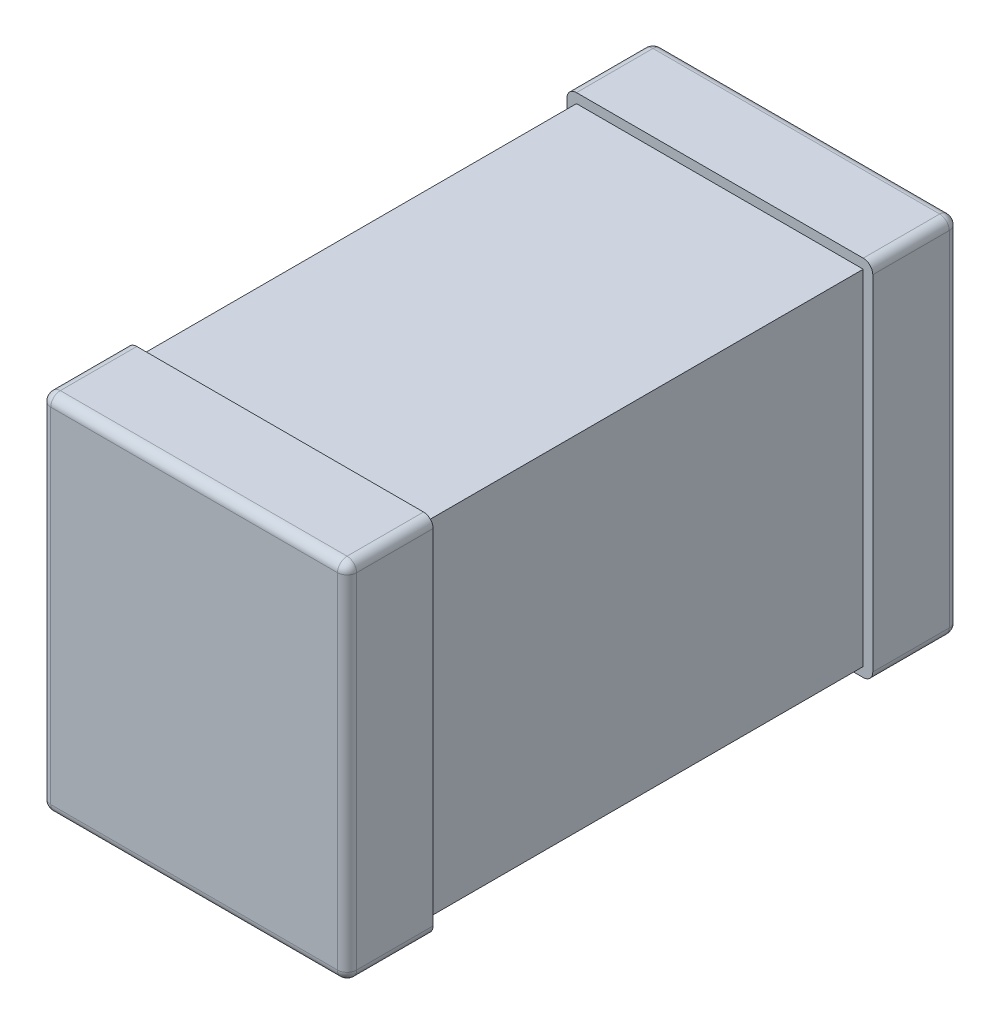
ISO-10303-21;
HEADER;
FILE_DESCRIPTION(('STEP AP214'),'2;1');
FILE_NAME('part.step','',(''),(''),'','','');
FILE_SCHEMA(('AUTOMOTIVE_DESIGN { 1 0 10303 214 1 1 1 1 }'));
ENDSEC;
DATA;
#1=APPLICATION_CONTEXT('core data for automotive mechanical design processes');
#2=APPLICATION_PROTOCOL_DEFINITION('international standard','automotive_design',2000,#1);
#3=PRODUCT_CONTEXT('',#1,'mechanical');
#4=PRODUCT('Part','Part','',(#3));
#5=PRODUCT_RELATED_PRODUCT_CATEGORY('part','',(#4));
#6=PRODUCT_DEFINITION_FORMATION('','',#4);
#7=PRODUCT_DEFINITION_CONTEXT('part definition',#1,'design');
#8=PRODUCT_DEFINITION('design','',#6,#7);
#9=PRODUCT_DEFINITION_SHAPE('','',#8);
#10=(LENGTH_UNIT() NAMED_UNIT(*) SI_UNIT(.MILLI.,.METRE.));
#11=(NAMED_UNIT(*) PLANE_ANGLE_UNIT() SI_UNIT($,.RADIAN.));
#12=(NAMED_UNIT(*) SI_UNIT($,.STERADIAN.) SOLID_ANGLE_UNIT());
#13=UNCERTAINTY_MEASURE_WITH_UNIT(LENGTH_MEASURE(1.E-05),#10,'distance_accuracy_value','');
#14=(GEOMETRIC_REPRESENTATION_CONTEXT(3) GLOBAL_UNCERTAINTY_ASSIGNED_CONTEXT((#13)) GLOBAL_UNIT_ASSIGNED_CONTEXT((#10,
#11,#12)) REPRESENTATION_CONTEXT('',''));
#15=CARTESIAN_POINT('',(0.,0.,0.));
#16=DIRECTION('',(0.,0.,1.));
#17=DIRECTION('',(1.,0.,0.));
#18=AXIS2_PLACEMENT_3D('',#15,#16,#17);
#19=CARTESIAN_POINT('',(-0.8,1.9,1.6));
#20=DIRECTION('',(0.,0.,-1.));
#21=DIRECTION('',(-1.,0.,0.));
#22=AXIS2_PLACEMENT_3D('',#19,#20,#21);
#23=PLANE('',#22);
#24=DIRECTION('',(0.,-1.,0.));
#25=VECTOR('',#24,1.);
#26=CARTESIAN_POINT('',(-0.75,1.9,1.6));
#27=LINE('',#26,#25);
#28=CARTESIAN_POINT('',(-0.75,0.0499999999999999,1.6));
#29=VERTEX_POINT('',#28);
#30=CARTESIAN_POINT('',(-0.75,1.85,1.6));
#31=VERTEX_POINT('',#30);
#32=EDGE_CURVE('E552',#29,#31,#27,.F.);
#33=ORIENTED_EDGE('',*,*,#32,.F.);
#34=DIRECTION('',(1.,0.,0.));
#35=VECTOR('',#34,1.);
#36=CARTESIAN_POINT('',(-0.8,0.0499999999999999,1.6));
#37=LINE('',#36,#35);
#38=CARTESIAN_POINT('',(0.75,0.0499999999999341,1.6));
#39=VERTEX_POINT('',#38);
#40=EDGE_CURVE('E479',#39,#29,#37,.F.);
#41=ORIENTED_EDGE('',*,*,#40,.F.);
#42=DIRECTION('',(0.,-1.,0.));
#43=VECTOR('',#42,1.);
#44=CARTESIAN_POINT('',(0.75,1.9,1.6));
#45=LINE('',#44,#43);
#46=CARTESIAN_POINT('',(0.75,1.85,1.6));
#47=VERTEX_POINT('',#46);
#48=EDGE_CURVE('E537',#47,#39,#45,.T.);
#49=ORIENTED_EDGE('',*,*,#48,.F.);
#50=DIRECTION('',(-1.,0.,0.));
#51=VECTOR('',#50,1.);
#52=CARTESIAN_POINT('',(-0.8,1.85,1.6));
#53=LINE('',#52,#51);
#54=EDGE_CURVE('E523',#31,#47,#53,.F.);
#55=ORIENTED_EDGE('',*,*,#54,.F.);
#56=EDGE_LOOP('',(#33,#41,#49,#55));
#57=FACE_BOUND('',#56,.T.);
#58=ADVANCED_FACE('F16',(#57),#23,.F.);
#59=CARTESIAN_POINT('',(-0.800000000000001,1.9,-1.6));
#60=DIRECTION('',(0.,0.,1.));
#61=DIRECTION('',(1.,0.,0.));
#62=AXIS2_PLACEMENT_3D('',#59,#60,#61);
#63=PLANE('',#62);
#64=DIRECTION('',(0.,-1.,0.));
#65=VECTOR('',#64,1.);
#66=CARTESIAN_POINT('',(0.750000000000001,1.9,-1.6));
#67=LINE('',#66,#65);
#68=CARTESIAN_POINT('',(0.750000000000001,0.0499999999999999,-1.6));
#69=VERTEX_POINT('',#68);
#70=CARTESIAN_POINT('',(0.750000000000001,1.85,-1.6));
#71=VERTEX_POINT('',#70);
#72=EDGE_CURVE('E513',#69,#71,#67,.F.);
#73=ORIENTED_EDGE('',*,*,#72,.F.);
#74=DIRECTION('',(1.,0.,0.));
#75=VECTOR('',#74,1.);
#76=CARTESIAN_POINT('',(-0.800000000000001,0.0499999999999999,-1.6));
#77=LINE('',#76,#75);
#78=CARTESIAN_POINT('',(-0.750000000000001,0.0499999999999999,-1.6));
#79=VERTEX_POINT('',#78);
#80=EDGE_CURVE('E519',#79,#69,#77,.T.);
#81=ORIENTED_EDGE('',*,*,#80,.F.);
#82=DIRECTION('',(0.,-1.,0.));
#83=VECTOR('',#82,1.);
#84=CARTESIAN_POINT('',(-0.750000000000001,1.9,-1.6));
#85=LINE('',#84,#83);
#86=CARTESIAN_POINT('',(-0.750000000000001,1.85,-1.6));
#87=VERTEX_POINT('',#86);
#88=EDGE_CURVE('E531',#87,#79,#85,.T.);
#89=ORIENTED_EDGE('',*,*,#88,.F.);
#90=DIRECTION('',(1.,0.,0.));
#91=VECTOR('',#90,1.);
#92=CARTESIAN_POINT('',(-0.8,1.85,-1.6));
#93=LINE('',#92,#91);
#94=EDGE_CURVE('E373',#71,#87,#93,.F.);
#95=ORIENTED_EDGE('',*,*,#94,.F.);
#96=EDGE_LOOP('',(#73,#81,#89,#95));
#97=FACE_BOUND('',#96,.T.);
#98=ADVANCED_FACE('F506',(#97),#63,.F.);
#99=CARTESIAN_POINT('',(-0.75,1.85,1.55));
#100=DIRECTION('',(1.,0.,0.));
#101=DIRECTION('',(0.,0.,-1.));
#102=AXIS2_PLACEMENT_3D('',#99,#100,#101);
#103=SPHERICAL_SURFACE('',#102,0.05);
#104=CARTESIAN_POINT('',(-0.75,1.85,1.55));
#105=DIRECTION('',(0.,0.,-1.));
#106=DIRECTION('',(-1.,0.,0.));
#107=AXIS2_PLACEMENT_3D('',#104,#105,#106);
#108=CIRCLE('',#107,0.05);
#109=CARTESIAN_POINT('',(-0.8,1.85,1.55));
#110=VERTEX_POINT('',#109);
#111=CARTESIAN_POINT('',(-0.75,1.9,1.55));
#112=VERTEX_POINT('',#111);
#113=EDGE_CURVE('E189',#110,#112,#108,.T.);
#114=ORIENTED_EDGE('',*,*,#113,.F.);
#115=CARTESIAN_POINT('',(-0.75,1.85,1.55));
#116=DIRECTION('',(0.,-1.,0.));
#117=DIRECTION('',(0.,0.,-1.));
#118=AXIS2_PLACEMENT_3D('',#115,#116,#117);
#119=CIRCLE('',#118,0.0499999999999999);
#120=EDGE_CURVE('E522',#31,#110,#119,.T.);
#121=ORIENTED_EDGE('',*,*,#120,.F.);
#122=CARTESIAN_POINT('',(-0.75,1.85,1.55));
#123=DIRECTION('',(-1.,0.,0.));
#124=DIRECTION('',(0.,0.,1.));
#125=AXIS2_PLACEMENT_3D('',#122,#123,#124);
#126=CIRCLE('',#125,0.0499999999999999);
#127=EDGE_CURVE('E429',#112,#31,#126,.F.);
#128=ORIENTED_EDGE('',*,*,#127,.F.);
#129=EDGE_LOOP('',(#114,#121,#128));
#130=FACE_BOUND('',#129,.T.);
#131=ADVANCED_FACE('F502',(#130),#103,.T.);
#132=CARTESIAN_POINT('',(-0.75,1.9,1.55));
#133=DIRECTION('',(0.,-1.,0.));
#134=DIRECTION('',(0.,0.,-1.));
#135=AXIS2_PLACEMENT_3D('',#132,#133,#134);
#136=CYLINDRICAL_SURFACE('',#135,0.0499999999999999);
#137=CARTESIAN_POINT('',(-0.75,0.05,1.55));
#138=DIRECTION('',(0.,-1.,0.));
#139=DIRECTION('',(1.,0.,0.));
#140=AXIS2_PLACEMENT_3D('',#137,#138,#139);
#141=CIRCLE('',#140,0.05);
#142=CARTESIAN_POINT('',(-0.8,0.0499999999999999,1.55));
#143=VERTEX_POINT('',#142);
#144=EDGE_CURVE('E493',#29,#143,#141,.T.);
#145=ORIENTED_EDGE('',*,*,#144,.F.);
#146=ORIENTED_EDGE('',*,*,#32,.T.);
#147=ORIENTED_EDGE('',*,*,#120,.T.);
#148=DIRECTION('',(0.,1.,0.));
#149=VECTOR('',#148,1.);
#150=CARTESIAN_POINT('',(-0.8,1.9,1.55));
#151=LINE('',#150,#149);
#152=EDGE_CURVE('E186',#110,#143,#151,.F.);
#153=ORIENTED_EDGE('',*,*,#152,.T.);
#154=EDGE_LOOP('',(#145,#146,#147,#153));
#155=FACE_BOUND('',#154,.T.);
#156=ADVANCED_FACE('F498',(#155),#136,.T.);
#157=CARTESIAN_POINT('',(-0.75,0.05,1.55));
#158=DIRECTION('',(1.,0.,0.));
#159=DIRECTION('',(0.,0.,-1.));
#160=AXIS2_PLACEMENT_3D('',#157,#158,#159);
#161=SPHERICAL_SURFACE('',#160,0.05);
#162=CARTESIAN_POINT('',(-0.75,0.0499999999999999,1.55));
#163=DIRECTION('',(1.,0.,0.));
#164=DIRECTION('',(0.,0.,-1.));
#165=AXIS2_PLACEMENT_3D('',#162,#163,#164);
#166=CIRCLE('',#165,0.0499999999999999);
#167=CARTESIAN_POINT('',(-0.75,0.,1.55));
#168=VERTEX_POINT('',#167);
#169=EDGE_CURVE('E474',#29,#168,#166,.T.);
#170=ORIENTED_EDGE('',*,*,#169,.F.);
#171=ORIENTED_EDGE('',*,*,#144,.T.);
#172=CARTESIAN_POINT('',(-0.75,0.0499999999999999,1.55));
#173=DIRECTION('',(0.,0.,1.));
#174=DIRECTION('',(1.,0.,0.));
#175=AXIS2_PLACEMENT_3D('',#172,#173,#174);
#176=CIRCLE('',#175,0.05);
#177=EDGE_CURVE('E309',#168,#143,#176,.F.);
#178=ORIENTED_EDGE('',*,*,#177,.F.);
#179=EDGE_LOOP('',(#170,#171,#178));
#180=FACE_BOUND('',#179,.T.);
#181=ADVANCED_FACE('F495',(#180),#161,.T.);
#182=CARTESIAN_POINT('',(-0.8,0.0499999999999999,1.55));
#183=DIRECTION('',(1.,0.,0.));
#184=DIRECTION('',(0.,0.,-1.));
#185=AXIS2_PLACEMENT_3D('',#182,#183,#184);
#186=CYLINDRICAL_SURFACE('',#185,0.0499999999999999);
#187=ORIENTED_EDGE('',*,*,#169,.T.);
#188=DIRECTION('',(1.,0.,0.));
#189=VECTOR('',#188,1.);
#190=CARTESIAN_POINT('',(-0.8,0.,1.55));
#191=LINE('',#190,#189);
#192=CARTESIAN_POINT('',(0.75,0.,1.55));
#193=VERTEX_POINT('',#192);
#194=EDGE_CURVE('E303',#168,#193,#191,.T.);
#195=ORIENTED_EDGE('',*,*,#194,.T.);
#196=CARTESIAN_POINT('',(0.75,0.05,1.55));
#197=DIRECTION('',(1.,0.,0.));
#198=DIRECTION('',(0.,0.,-1.));
#199=AXIS2_PLACEMENT_3D('',#196,#197,#198);
#200=CIRCLE('',#199,0.0499999999999999);
#201=EDGE_CURVE('E470',#39,#193,#200,.T.);
#202=ORIENTED_EDGE('',*,*,#201,.F.);
#203=ORIENTED_EDGE('',*,*,#40,.T.);
#204=EDGE_LOOP('',(#187,#195,#202,#203));
#205=FACE_BOUND('',#204,.T.);
#206=ADVANCED_FACE('F462',(#205),#186,.T.);
#207=CARTESIAN_POINT('',(0.75,0.05,1.55));
#208=DIRECTION('',(1.,0.,0.));
#209=DIRECTION('',(0.,0.,-1.));
#210=AXIS2_PLACEMENT_3D('',#207,#208,#209);
#211=SPHERICAL_SURFACE('',#210,0.05);
#212=CARTESIAN_POINT('',(0.75,0.0499999999999999,1.55));
#213=DIRECTION('',(0.,-1.,0.));
#214=DIRECTION('',(0.,0.,-1.));
#215=AXIS2_PLACEMENT_3D('',#212,#213,#214);
#216=CIRCLE('',#215,0.0499999999999999);
#217=CARTESIAN_POINT('',(0.8,0.0499999999999999,1.55));
#218=VERTEX_POINT('',#217);
#219=EDGE_CURVE('E473',#39,#218,#216,.F.);
#220=ORIENTED_EDGE('',*,*,#219,.F.);
#221=ORIENTED_EDGE('',*,*,#201,.T.);
#222=CARTESIAN_POINT('',(0.75,0.0499999999999999,1.55));
#223=DIRECTION('',(0.,0.,-1.));
#224=DIRECTION('',(-1.,0.,0.));
#225=AXIS2_PLACEMENT_3D('',#222,#223,#224);
#226=CIRCLE('',#225,0.05);
#227=EDGE_CURVE('E296',#218,#193,#226,.T.);
#228=ORIENTED_EDGE('',*,*,#227,.F.);
#229=EDGE_LOOP('',(#220,#221,#228));
#230=FACE_BOUND('',#229,.T.);
#231=ADVANCED_FACE('F457',(#230),#211,.T.);
#232=CARTESIAN_POINT('',(0.75,1.9,1.55));
#233=DIRECTION('',(0.,-1.,0.));
#234=DIRECTION('',(0.,0.,-1.));
#235=AXIS2_PLACEMENT_3D('',#232,#233,#234);
#236=CYLINDRICAL_SURFACE('',#235,0.0499999999999999);
#237=CARTESIAN_POINT('',(0.75,1.85,1.55));
#238=DIRECTION('',(0.,-1.,0.));
#239=DIRECTION('',(1.,0.,0.));
#240=AXIS2_PLACEMENT_3D('',#237,#238,#239);
#241=CIRCLE('',#240,0.05);
#242=CARTESIAN_POINT('',(0.8,1.85,1.55));
#243=VERTEX_POINT('',#242);
#244=EDGE_CURVE('E439',#47,#243,#241,.F.);
#245=ORIENTED_EDGE('',*,*,#244,.F.);
#246=ORIENTED_EDGE('',*,*,#48,.T.);
#247=ORIENTED_EDGE('',*,*,#219,.T.);
#248=DIRECTION('',(0.,1.,0.));
#249=VECTOR('',#248,1.);
#250=CARTESIAN_POINT('',(0.8,1.9,1.55));
#251=LINE('',#250,#249);
#252=EDGE_CURVE('E290',#218,#243,#251,.T.);
#253=ORIENTED_EDGE('',*,*,#252,.T.);
#254=EDGE_LOOP('',(#245,#246,#247,#253));
#255=FACE_BOUND('',#254,.T.);
#256=ADVANCED_FACE('F453',(#255),#236,.T.);
#257=CARTESIAN_POINT('',(0.75,1.85,1.55));
#258=DIRECTION('',(1.,0.,0.));
#259=DIRECTION('',(0.,0.,-1.));
#260=AXIS2_PLACEMENT_3D('',#257,#258,#259);
#261=SPHERICAL_SURFACE('',#260,0.05);
#262=CARTESIAN_POINT('',(0.75,1.85,1.55));
#263=DIRECTION('',(0.,0.,1.));
#264=DIRECTION('',(1.,0.,0.));
#265=AXIS2_PLACEMENT_3D('',#262,#263,#264);
#266=CIRCLE('',#265,0.05);
#267=CARTESIAN_POINT('',(0.75,1.9,1.55));
#268=VERTEX_POINT('',#267);
#269=EDGE_CURVE('E283',#268,#243,#266,.F.);
#270=ORIENTED_EDGE('',*,*,#269,.F.);
#271=CARTESIAN_POINT('',(0.75,1.85,1.55));
#272=DIRECTION('',(-1.,0.,0.));
#273=DIRECTION('',(0.,0.,1.));
#274=AXIS2_PLACEMENT_3D('',#271,#272,#273);
#275=CIRCLE('',#274,0.0499999999999999);
#276=EDGE_CURVE('E434',#47,#268,#275,.T.);
#277=ORIENTED_EDGE('',*,*,#276,.F.);
#278=ORIENTED_EDGE('',*,*,#244,.T.);
#279=EDGE_LOOP('',(#270,#277,#278));
#280=FACE_BOUND('',#279,.T.);
#281=ADVANCED_FACE('F450',(#280),#261,.T.);
#282=CARTESIAN_POINT('',(-0.8,1.85,1.55));
#283=DIRECTION('',(-1.,0.,0.));
#284=DIRECTION('',(0.,0.,1.));
#285=AXIS2_PLACEMENT_3D('',#282,#283,#284);
#286=CYLINDRICAL_SURFACE('',#285,0.0499999999999999);
#287=ORIENTED_EDGE('',*,*,#127,.T.);
#288=ORIENTED_EDGE('',*,*,#54,.T.);
#289=ORIENTED_EDGE('',*,*,#276,.T.);
#290=DIRECTION('',(1.,0.,0.));
#291=VECTOR('',#290,1.);
#292=CARTESIAN_POINT('',(-0.8,1.9,1.55));
#293=LINE('',#292,#291);
#294=EDGE_CURVE('E273',#112,#268,#293,.T.);
#295=ORIENTED_EDGE('',*,*,#294,.F.);
#296=EDGE_LOOP('',(#287,#288,#289,#295));
#297=FACE_BOUND('',#296,.T.);
#298=ADVANCED_FACE('F407',(#297),#286,.T.);
#299=CARTESIAN_POINT('',(-0.750000000000001,0.05,-1.55));
#300=DIRECTION('',(1.,0.,0.));
#301=DIRECTION('',(0.,0.,-1.));
#302=AXIS2_PLACEMENT_3D('',#299,#300,#301);
#303=SPHERICAL_SURFACE('',#302,0.05);
#304=CARTESIAN_POINT('',(-0.750000000000001,0.0499999999999999,-1.55));
#305=DIRECTION('',(0.,-1.,0.));
#306=DIRECTION('',(0.,0.,-1.));
#307=AXIS2_PLACEMENT_3D('',#304,#305,#306);
#308=CIRCLE('',#307,0.0499999999999999);
#309=CARTESIAN_POINT('',(-0.800000000000001,0.0499999999999999,-1.55));
#310=VERTEX_POINT('',#309);
#311=EDGE_CURVE('E433',#79,#310,#308,.F.);
#312=ORIENTED_EDGE('',*,*,#311,.F.);
#313=CARTESIAN_POINT('',(-0.750000000000001,0.0499999999999999,-1.55));
#314=DIRECTION('',(-1.,0.,0.));
#315=DIRECTION('',(0.,0.,1.));
#316=AXIS2_PLACEMENT_3D('',#313,#314,#315);
#317=CIRCLE('',#316,0.0499999999999999);
#318=CARTESIAN_POINT('',(-0.750000000000001,0.,-1.55));
#319=VERTEX_POINT('',#318);
#320=EDGE_CURVE('E324',#319,#79,#317,.F.);
#321=ORIENTED_EDGE('',*,*,#320,.F.);
#322=CARTESIAN_POINT('',(-0.750000000000001,0.0499999999999999,-1.55));
#323=DIRECTION('',(0.,0.,1.));
#324=DIRECTION('',(1.,0.,0.));
#325=AXIS2_PLACEMENT_3D('',#322,#323,#324);
#326=CIRCLE('',#325,0.05);
#327=EDGE_CURVE('E267',#310,#319,#326,.T.);
#328=ORIENTED_EDGE('',*,*,#327,.F.);
#329=EDGE_LOOP('',(#312,#321,#328));
#330=FACE_BOUND('',#329,.T.);
#331=ADVANCED_FACE('F402',(#330),#303,.T.);
#332=CARTESIAN_POINT('',(-0.750000000000001,1.9,-1.55));
#333=DIRECTION('',(0.,-1.,0.));
#334=DIRECTION('',(0.,0.,-1.));
#335=AXIS2_PLACEMENT_3D('',#332,#333,#334);
#336=CYLINDRICAL_SURFACE('',#335,0.0499999999999999);
#337=CARTESIAN_POINT('',(-0.750000000000001,1.85,-1.55));
#338=DIRECTION('',(0.,1.,0.));
#339=DIRECTION('',(1.,0.,0.));
#340=AXIS2_PLACEMENT_3D('',#337,#338,#339);
#341=CIRCLE('',#340,0.05);
#342=CARTESIAN_POINT('',(-0.800000000000001,1.85,-1.55));
#343=VERTEX_POINT('',#342);
#344=EDGE_CURVE('E384',#87,#343,#341,.T.);
#345=ORIENTED_EDGE('',*,*,#344,.F.);
#346=ORIENTED_EDGE('',*,*,#88,.T.);
#347=ORIENTED_EDGE('',*,*,#311,.T.);
#348=DIRECTION('',(0.,1.,0.));
#349=VECTOR('',#348,1.);
#350=CARTESIAN_POINT('',(-0.800000000000001,1.9,-1.55));
#351=LINE('',#350,#349);
#352=EDGE_CURVE('E266',#310,#343,#351,.T.);
#353=ORIENTED_EDGE('',*,*,#352,.T.);
#354=EDGE_LOOP('',(#345,#346,#347,#353));
#355=FACE_BOUND('',#354,.T.);
#356=ADVANCED_FACE('F398',(#355),#336,.T.);
#357=CARTESIAN_POINT('',(-0.750000000000001,1.85,-1.55));
#358=DIRECTION('',(1.,0.,0.));
#359=DIRECTION('',(0.,0.,-1.));
#360=AXIS2_PLACEMENT_3D('',#357,#358,#359);
#361=SPHERICAL_SURFACE('',#360,0.05);
#362=CARTESIAN_POINT('',(-0.750000000000001,1.85,-1.55));
#363=DIRECTION('',(0.,0.,-1.));
#364=DIRECTION('',(-1.,0.,0.));
#365=AXIS2_PLACEMENT_3D('',#362,#363,#364);
#366=CIRCLE('',#365,0.05);
#367=CARTESIAN_POINT('',(-0.750000000000001,1.9,-1.55));
#368=VERTEX_POINT('',#367);
#369=EDGE_CURVE('E259',#368,#343,#366,.F.);
#370=ORIENTED_EDGE('',*,*,#369,.F.);
#371=CARTESIAN_POINT('',(-0.750000000000001,1.85,-1.55));
#372=DIRECTION('',(1.,0.,0.));
#373=DIRECTION('',(0.,0.,-1.));
#374=AXIS2_PLACEMENT_3D('',#371,#372,#373);
#375=CIRCLE('',#374,0.0499999999999999);
#376=EDGE_CURVE('E381',#87,#368,#375,.T.);
#377=ORIENTED_EDGE('',*,*,#376,.F.);
#378=ORIENTED_EDGE('',*,*,#344,.T.);
#379=EDGE_LOOP('',(#370,#377,#378));
#380=FACE_BOUND('',#379,.T.);
#381=ADVANCED_FACE('F395',(#380),#361,.T.);
#382=CARTESIAN_POINT('',(-0.8,1.85,-1.55));
#383=DIRECTION('',(1.,0.,0.));
#384=DIRECTION('',(0.,0.,-1.));
#385=AXIS2_PLACEMENT_3D('',#382,#383,#384);
#386=CYLINDRICAL_SURFACE('',#385,0.0499999999999999);
#387=CARTESIAN_POINT('',(0.750000000000001,1.85,-1.55));
#388=DIRECTION('',(1.,0.,0.));
#389=DIRECTION('',(0.,0.,-1.));
#390=AXIS2_PLACEMENT_3D('',#387,#388,#389);
#391=CIRCLE('',#390,0.0499999999999999);
#392=CARTESIAN_POINT('',(0.750000000000001,1.9,-1.55));
#393=VERTEX_POINT('',#392);
#394=EDGE_CURVE('E369',#71,#393,#391,.T.);
#395=ORIENTED_EDGE('',*,*,#394,.F.);
#396=ORIENTED_EDGE('',*,*,#94,.T.);
#397=ORIENTED_EDGE('',*,*,#376,.T.);
#398=DIRECTION('',(1.,0.,0.));
#399=VECTOR('',#398,1.);
#400=CARTESIAN_POINT('',(-0.8,1.9,-1.55));
#401=LINE('',#400,#399);
#402=EDGE_CURVE('E253',#393,#368,#401,.F.);
#403=ORIENTED_EDGE('',*,*,#402,.F.);
#404=EDGE_LOOP('',(#395,#396,#397,#403));
#405=FACE_BOUND('',#404,.T.);
#406=ADVANCED_FACE('F361',(#405),#386,.T.);
#407=CARTESIAN_POINT('',(0.750000000000001,1.85,-1.55));
#408=DIRECTION('',(1.,0.,0.));
#409=DIRECTION('',(0.,0.,-1.));
#410=AXIS2_PLACEMENT_3D('',#407,#408,#409);
#411=SPHERICAL_SURFACE('',#410,0.05);
#412=CARTESIAN_POINT('',(0.750000000000001,1.85,-1.55));
#413=DIRECTION('',(0.,0.,1.));
#414=DIRECTION('',(1.,0.,0.));
#415=AXIS2_PLACEMENT_3D('',#412,#413,#414);
#416=CIRCLE('',#415,0.05);
#417=CARTESIAN_POINT('',(0.800000000000001,1.85,-1.55));
#418=VERTEX_POINT('',#417);
#419=EDGE_CURVE('E247',#418,#393,#416,.T.);
#420=ORIENTED_EDGE('',*,*,#419,.F.);
#421=CARTESIAN_POINT('',(0.750000000000001,1.85,-1.55));
#422=DIRECTION('',(0.,-1.,0.));
#423=DIRECTION('',(0.,0.,-1.));
#424=AXIS2_PLACEMENT_3D('',#421,#422,#423);
#425=CIRCLE('',#424,0.0499999999999999);
#426=EDGE_CURVE('E372',#71,#418,#425,.T.);
#427=ORIENTED_EDGE('',*,*,#426,.F.);
#428=ORIENTED_EDGE('',*,*,#394,.T.);
#429=EDGE_LOOP('',(#420,#427,#428));
#430=FACE_BOUND('',#429,.T.);
#431=ADVANCED_FACE('F356',(#430),#411,.T.);
#432=CARTESIAN_POINT('',(0.750000000000001,1.9,-1.55));
#433=DIRECTION('',(0.,-1.,0.));
#434=DIRECTION('',(0.,0.,-1.));
#435=AXIS2_PLACEMENT_3D('',#432,#433,#434);
#436=CYLINDRICAL_SURFACE('',#435,0.0499999999999999);
#437=CARTESIAN_POINT('',(0.750000000000001,0.05,-1.55));
#438=DIRECTION('',(0.,1.,0.));
#439=DIRECTION('',(1.,0.,0.));
#440=AXIS2_PLACEMENT_3D('',#437,#438,#439);
#441=CIRCLE('',#440,0.05);
#442=CARTESIAN_POINT('',(0.800000000000001,0.0499999999999999,-1.55));
#443=VERTEX_POINT('',#442);
#444=EDGE_CURVE('E334',#69,#443,#441,.F.);
#445=ORIENTED_EDGE('',*,*,#444,.F.);
#446=ORIENTED_EDGE('',*,*,#72,.T.);
#447=ORIENTED_EDGE('',*,*,#426,.T.);
#448=DIRECTION('',(0.,1.,0.));
#449=VECTOR('',#448,1.);
#450=CARTESIAN_POINT('',(0.800000000000001,1.9,-1.55));
#451=LINE('',#450,#449);
#452=EDGE_CURVE('E241',#418,#443,#451,.F.);
#453=ORIENTED_EDGE('',*,*,#452,.T.);
#454=EDGE_LOOP('',(#445,#446,#447,#453));
#455=FACE_BOUND('',#454,.T.);
#456=ADVANCED_FACE('F351',(#455),#436,.T.);
#457=CARTESIAN_POINT('',(0.750000000000001,0.05,-1.55));
#458=DIRECTION('',(1.,0.,0.));
#459=DIRECTION('',(0.,0.,-1.));
#460=AXIS2_PLACEMENT_3D('',#457,#458,#459);
#461=SPHERICAL_SURFACE('',#460,0.05);
#462=CARTESIAN_POINT('',(0.750000000000001,0.0499999999999999,-1.55));
#463=DIRECTION('',(-1.,0.,0.));
#464=DIRECTION('',(0.,0.,1.));
#465=AXIS2_PLACEMENT_3D('',#462,#463,#464);
#466=CIRCLE('',#465,0.0499999999999999);
#467=CARTESIAN_POINT('',(0.750000000000001,0.,-1.55));
#468=VERTEX_POINT('',#467);
#469=EDGE_CURVE('E321',#69,#468,#466,.T.);
#470=ORIENTED_EDGE('',*,*,#469,.F.);
#471=ORIENTED_EDGE('',*,*,#444,.T.);
#472=CARTESIAN_POINT('',(0.750000000000001,0.0499999999999999,-1.55));
#473=DIRECTION('',(0.,0.,-1.));
#474=DIRECTION('',(-1.,0.,0.));
#475=AXIS2_PLACEMENT_3D('',#472,#473,#474);
#476=CIRCLE('',#475,0.05);
#477=EDGE_CURVE('E234',#468,#443,#476,.F.);
#478=ORIENTED_EDGE('',*,*,#477,.F.);
#479=EDGE_LOOP('',(#470,#471,#478));
#480=FACE_BOUND('',#479,.T.);
#481=ADVANCED_FACE('F346',(#480),#461,.T.);
#482=CARTESIAN_POINT('',(-0.800000000000001,0.0499999999999999,-1.55));
#483=DIRECTION('',(-1.,0.,0.));
#484=DIRECTION('',(0.,0.,1.));
#485=AXIS2_PLACEMENT_3D('',#482,#483,#484);
#486=CYLINDRICAL_SURFACE('',#485,0.0499999999999999);
#487=ORIENTED_EDGE('',*,*,#469,.T.);
#488=DIRECTION('',(1.,0.,0.));
#489=VECTOR('',#488,1.);
#490=CARTESIAN_POINT('',(-0.8,0.,-1.55));
#491=LINE('',#490,#489);
#492=EDGE_CURVE('E209',#468,#319,#491,.F.);
#493=ORIENTED_EDGE('',*,*,#492,.T.);
#494=ORIENTED_EDGE('',*,*,#320,.T.);
#495=ORIENTED_EDGE('',*,*,#80,.T.);
#496=EDGE_LOOP('',(#487,#493,#494,#495));
#497=FACE_BOUND('',#496,.T.);
#498=ADVANCED_FACE('F350',(#497),#486,.T.);
#499=CARTESIAN_POINT('',(-0.75,1.85,1.6));
#500=DIRECTION('',(0.,0.,-1.));
#501=DIRECTION('',(-1.,0.,0.));
#502=AXIS2_PLACEMENT_3D('',#499,#500,#501);
#503=CYLINDRICAL_SURFACE('',#502,0.05);
#504=ORIENTED_EDGE('',*,*,#113,.T.);
#505=DIRECTION('',(0.,0.,1.));
#506=VECTOR('',#505,1.);
#507=CARTESIAN_POINT('',(-0.75,1.9,1.6));
#508=LINE('',#507,#506);
#509=CARTESIAN_POINT('',(-0.75,1.9,1.15));
#510=VERTEX_POINT('',#509);
#511=EDGE_CURVE('E202',#510,#112,#508,.T.);
#512=ORIENTED_EDGE('',*,*,#511,.F.);
#513=CARTESIAN_POINT('',(-0.75,1.85,1.15));
#514=DIRECTION('',(0.,0.,-1.));
#515=DIRECTION('',(-1.,0.,0.));
#516=AXIS2_PLACEMENT_3D('',#513,#514,#515);
#517=CIRCLE('',#516,0.05);
#518=CARTESIAN_POINT('',(-0.800000000000001,1.85,1.15));
#519=VERTEX_POINT('',#518);
#520=EDGE_CURVE('E19',#510,#519,#517,.F.);
#521=ORIENTED_EDGE('',*,*,#520,.T.);
#522=DIRECTION('',(0.,0.,-1.));
#523=VECTOR('',#522,1.);
#524=CARTESIAN_POINT('',(-0.800000000000001,1.85,-1.6));
#525=LINE('',#524,#523);
#526=EDGE_CURVE('E181',#519,#110,#525,.F.);
#527=ORIENTED_EDGE('',*,*,#526,.T.);
#528=EDGE_LOOP('',(#504,#512,#521,#527));
#529=FACE_BOUND('',#528,.T.);
#530=ADVANCED_FACE('F200',(#529),#503,.T.);
#531=CARTESIAN_POINT('',(-0.800000000000001,1.9,-1.6));
#532=DIRECTION('',(1.,0.,0.));
#533=DIRECTION('',(0.,0.,-1.));
#534=AXIS2_PLACEMENT_3D('',#531,#532,#533);
#535=PLANE('',#534);
#536=ORIENTED_EDGE('',*,*,#526,.F.);
#537=DIRECTION('',(0.,1.,0.));
#538=VECTOR('',#537,1.);
#539=CARTESIAN_POINT('',(-0.800000000000001,1.93562670458647,1.15));
#540=LINE('',#539,#538);
#541=CARTESIAN_POINT('',(-0.800000000000001,0.0499999999999999,1.15));
#542=VERTEX_POINT('',#541);
#543=EDGE_CURVE('E184',#519,#542,#540,.F.);
#544=ORIENTED_EDGE('',*,*,#543,.T.);
#545=DIRECTION('',(0.,0.,1.));
#546=VECTOR('',#545,1.);
#547=CARTESIAN_POINT('',(-0.800000000000001,0.0499999999999999,-1.6));
#548=LINE('',#547,#546);
#549=EDGE_CURVE('E304',#143,#542,#548,.F.);
#550=ORIENTED_EDGE('',*,*,#549,.F.);
#551=ORIENTED_EDGE('',*,*,#152,.F.);
#552=EDGE_LOOP('',(#536,#544,#550,#551));
#553=FACE_BOUND('',#552,.T.);
#554=ADVANCED_FACE('F182',(#553),#535,.F.);
#555=CARTESIAN_POINT('',(-0.750000000000001,0.0499999999999999,-1.6));
#556=DIRECTION('',(0.,0.,1.));
#557=DIRECTION('',(1.,0.,0.));
#558=AXIS2_PLACEMENT_3D('',#555,#556,#557);
#559=CYLINDRICAL_SURFACE('',#558,0.05);
#560=ORIENTED_EDGE('',*,*,#177,.T.);
#561=ORIENTED_EDGE('',*,*,#549,.T.);
#562=CARTESIAN_POINT('',(-0.75,0.0499999999999999,1.15));
#563=DIRECTION('',(0.,0.,1.));
#564=DIRECTION('',(1.,0.,0.));
#565=AXIS2_PLACEMENT_3D('',#562,#563,#564);
#566=CIRCLE('',#565,0.05);
#567=CARTESIAN_POINT('',(-0.75,0.,1.15));
#568=VERTEX_POINT('',#567);
#569=EDGE_CURVE('E197',#542,#568,#566,.T.);
#570=ORIENTED_EDGE('',*,*,#569,.T.);
#571=DIRECTION('',(0.,0.,1.));
#572=VECTOR('',#571,1.);
#573=CARTESIAN_POINT('',(-0.75,0.,1.6));
#574=LINE('',#573,#572);
#575=EDGE_CURVE('E299',#568,#168,#574,.T.);
#576=ORIENTED_EDGE('',*,*,#575,.T.);
#577=EDGE_LOOP('',(#560,#561,#570,#576));
#578=FACE_BOUND('',#577,.T.);
#579=ADVANCED_FACE('F725',(#578),#559,.T.);
#580=CARTESIAN_POINT('',(-0.8,0.,1.6));
#581=DIRECTION('',(0.,1.,0.));
#582=DIRECTION('',(0.,0.,1.));
#583=AXIS2_PLACEMENT_3D('',#580,#581,#582);
#584=PLANE('',#583);
#585=ORIENTED_EDGE('',*,*,#575,.F.);
#586=DIRECTION('',(1.,0.,0.));
#587=VECTOR('',#586,1.);
#588=CARTESIAN_POINT('',(-0.800000000000001,0.,1.15));
#589=LINE('',#588,#587);
#590=CARTESIAN_POINT('',(0.75,0.,1.15));
#591=VERTEX_POINT('',#590);
#592=EDGE_CURVE('E588',#568,#591,#589,.T.);
#593=ORIENTED_EDGE('',*,*,#592,.T.);
#594=DIRECTION('',(0.,0.,-1.));
#595=VECTOR('',#594,1.);
#596=CARTESIAN_POINT('',(0.750000000000001,0.,-1.6));
#597=LINE('',#596,#595);
#598=EDGE_CURVE('E291',#193,#591,#597,.T.);
#599=ORIENTED_EDGE('',*,*,#598,.F.);
#600=ORIENTED_EDGE('',*,*,#194,.F.);
#601=EDGE_LOOP('',(#585,#593,#599,#600));
#602=FACE_BOUND('',#601,.T.);
#603=ADVANCED_FACE('F721',(#602),#584,.F.);
#604=CARTESIAN_POINT('',(0.750000000000001,0.0499999999999999,-1.6));
#605=DIRECTION('',(0.,0.,-1.));
#606=DIRECTION('',(-1.,0.,0.));
#607=AXIS2_PLACEMENT_3D('',#604,#605,#606);
#608=CYLINDRICAL_SURFACE('',#607,0.05);
#609=ORIENTED_EDGE('',*,*,#227,.T.);
#610=ORIENTED_EDGE('',*,*,#598,.T.);
#611=CARTESIAN_POINT('',(0.75,0.0499999999999999,1.15));
#612=DIRECTION('',(0.,0.,-1.));
#613=DIRECTION('',(-1.,0.,0.));
#614=AXIS2_PLACEMENT_3D('',#611,#612,#613);
#615=CIRCLE('',#614,0.05);
#616=CARTESIAN_POINT('',(0.8,0.0499999999999999,1.15));
#617=VERTEX_POINT('',#616);
#618=EDGE_CURVE('E585',#591,#617,#615,.F.);
#619=ORIENTED_EDGE('',*,*,#618,.T.);
#620=DIRECTION('',(0.,0.,1.));
#621=VECTOR('',#620,1.);
#622=CARTESIAN_POINT('',(0.800000000000001,0.0499999999999999,-1.6));
#623=LINE('',#622,#621);
#624=EDGE_CURVE('E286',#617,#218,#623,.T.);
#625=ORIENTED_EDGE('',*,*,#624,.T.);
#626=EDGE_LOOP('',(#609,#610,#619,#625));
#627=FACE_BOUND('',#626,.T.);
#628=ADVANCED_FACE('F717',(#627),#608,.T.);
#629=CARTESIAN_POINT('',(0.800000000000001,1.9,-1.6));
#630=DIRECTION('',(-1.,0.,0.));
#631=DIRECTION('',(0.,0.,1.));
#632=AXIS2_PLACEMENT_3D('',#629,#630,#631);
#633=PLANE('',#632);
#634=DIRECTION('',(0.,0.,1.));
#635=VECTOR('',#634,1.);
#636=CARTESIAN_POINT('',(0.8,1.85,1.6));
#637=LINE('',#636,#635);
#638=CARTESIAN_POINT('',(0.8,1.85,1.15));
#639=VERTEX_POINT('',#638);
#640=EDGE_CURVE('E280',#243,#639,#637,.F.);
#641=ORIENTED_EDGE('',*,*,#640,.F.);
#642=ORIENTED_EDGE('',*,*,#252,.F.);
#643=ORIENTED_EDGE('',*,*,#624,.F.);
#644=DIRECTION('',(0.,1.,0.));
#645=VECTOR('',#644,1.);
#646=CARTESIAN_POINT('',(0.8,1.93562670458647,1.15));
#647=LINE('',#646,#645);
#648=EDGE_CURVE('E584',#617,#639,#647,.T.);
#649=ORIENTED_EDGE('',*,*,#648,.T.);
#650=EDGE_LOOP('',(#641,#642,#643,#649));
#651=FACE_BOUND('',#650,.T.);
#652=ADVANCED_FACE('F713',(#651),#633,.F.);
#653=CARTESIAN_POINT('',(0.75,1.85,1.6));
#654=DIRECTION('',(0.,0.,1.));
#655=DIRECTION('',(1.,0.,0.));
#656=AXIS2_PLACEMENT_3D('',#653,#654,#655);
#657=CYLINDRICAL_SURFACE('',#656,0.05);
#658=ORIENTED_EDGE('',*,*,#269,.T.);
#659=ORIENTED_EDGE('',*,*,#640,.T.);
#660=CARTESIAN_POINT('',(0.75,1.85,1.15));
#661=DIRECTION('',(0.,0.,1.));
#662=DIRECTION('',(1.,0.,0.));
#663=AXIS2_PLACEMENT_3D('',#660,#661,#662);
#664=CIRCLE('',#663,0.05);
#665=CARTESIAN_POINT('',(0.75,1.9,1.15));
#666=VERTEX_POINT('',#665);
#667=EDGE_CURVE('E579',#639,#666,#664,.T.);
#668=ORIENTED_EDGE('',*,*,#667,.T.);
#669=DIRECTION('',(0.,0.,1.));
#670=VECTOR('',#669,1.);
#671=CARTESIAN_POINT('',(0.75,1.9,1.6));
#672=LINE('',#671,#670);
#673=EDGE_CURVE('E270',#268,#666,#672,.F.);
#674=ORIENTED_EDGE('',*,*,#673,.F.);
#675=EDGE_LOOP('',(#658,#659,#668,#674));
#676=FACE_BOUND('',#675,.T.);
#677=ADVANCED_FACE('F709',(#676),#657,.T.);
#678=CARTESIAN_POINT('',(-0.8,1.9,1.6));
#679=DIRECTION('',(0.,1.,0.));
#680=DIRECTION('',(0.,0.,1.));
#681=AXIS2_PLACEMENT_3D('',#678,#679,#680);
#682=PLANE('',#681);
#683=DIRECTION('',(1.,0.,0.));
#684=VECTOR('',#683,1.);
#685=CARTESIAN_POINT('',(-0.800000000000001,1.9,1.15));
#686=LINE('',#685,#684);
#687=EDGE_CURVE('E583',#666,#510,#686,.F.);
#688=ORIENTED_EDGE('',*,*,#687,.T.);
#689=ORIENTED_EDGE('',*,*,#511,.T.);
#690=ORIENTED_EDGE('',*,*,#294,.T.);
#691=ORIENTED_EDGE('',*,*,#673,.T.);
#692=EDGE_LOOP('',(#688,#689,#690,#691));
#693=FACE_BOUND('',#692,.T.);
#694=ADVANCED_FACE('F705',(#693),#682,.T.);
#695=CARTESIAN_POINT('',(-0.750000000000001,0.0499999999999999,-1.6));
#696=DIRECTION('',(0.,0.,1.));
#697=DIRECTION('',(1.,0.,0.));
#698=AXIS2_PLACEMENT_3D('',#695,#696,#697);
#699=CYLINDRICAL_SURFACE('',#698,0.05);
#700=ORIENTED_EDGE('',*,*,#327,.T.);
#701=DIRECTION('',(0.,0.,1.));
#702=VECTOR('',#701,1.);
#703=CARTESIAN_POINT('',(-0.750000000000001,0.,1.6));
#704=LINE('',#703,#702);
#705=CARTESIAN_POINT('',(-0.750000000000001,0.,-1.15));
#706=VERTEX_POINT('',#705);
#707=EDGE_CURVE('E223',#319,#706,#704,.T.);
#708=ORIENTED_EDGE('',*,*,#707,.T.);
#709=CARTESIAN_POINT('',(-0.750000000000001,0.0499999999999999,-1.15));
#710=DIRECTION('',(0.,0.,1.));
#711=DIRECTION('',(1.,0.,0.));
#712=AXIS2_PLACEMENT_3D('',#709,#710,#711);
#713=CIRCLE('',#712,0.05);
#714=CARTESIAN_POINT('',(-0.800000000000001,0.0499999999999999,-1.15));
#715=VERTEX_POINT('',#714);
#716=EDGE_CURVE('E574',#706,#715,#713,.F.);
#717=ORIENTED_EDGE('',*,*,#716,.T.);
#718=DIRECTION('',(0.,0.,-1.));
#719=VECTOR('',#718,1.);
#720=CARTESIAN_POINT('',(-0.800000000000001,0.0499999999999999,-1.6));
#721=LINE('',#720,#719);
#722=EDGE_CURVE('E262',#715,#310,#721,.T.);
#723=ORIENTED_EDGE('',*,*,#722,.T.);
#724=EDGE_LOOP('',(#700,#708,#717,#723));
#725=FACE_BOUND('',#724,.T.);
#726=ADVANCED_FACE('F701',(#725),#699,.T.);
#727=CARTESIAN_POINT('',(-0.800000000000001,1.9,-1.6));
#728=DIRECTION('',(1.,0.,0.));
#729=DIRECTION('',(0.,0.,-1.));
#730=AXIS2_PLACEMENT_3D('',#727,#728,#729);
#731=PLANE('',#730);
#732=ORIENTED_EDGE('',*,*,#722,.F.);
#733=DIRECTION('',(0.,1.,0.));
#734=VECTOR('',#733,1.);
#735=CARTESIAN_POINT('',(-0.800000000000001,1.93562670458647,-1.15));
#736=LINE('',#735,#734);
#737=CARTESIAN_POINT('',(-0.800000000000001,1.85,-1.15));
#738=VERTEX_POINT('',#737);
#739=EDGE_CURVE('E573',#715,#738,#736,.T.);
#740=ORIENTED_EDGE('',*,*,#739,.T.);
#741=DIRECTION('',(0.,0.,-1.));
#742=VECTOR('',#741,1.);
#743=CARTESIAN_POINT('',(-0.8,1.85,1.6));
#744=LINE('',#743,#742);
#745=EDGE_CURVE('E256',#343,#738,#744,.F.);
#746=ORIENTED_EDGE('',*,*,#745,.F.);
#747=ORIENTED_EDGE('',*,*,#352,.F.);
#748=EDGE_LOOP('',(#732,#740,#746,#747));
#749=FACE_BOUND('',#748,.T.);
#750=ADVANCED_FACE('F697',(#749),#731,.F.);
#751=CARTESIAN_POINT('',(-0.75,1.85,1.6));
#752=DIRECTION('',(0.,0.,-1.));
#753=DIRECTION('',(-1.,0.,0.));
#754=AXIS2_PLACEMENT_3D('',#751,#752,#753);
#755=CYLINDRICAL_SURFACE('',#754,0.05);
#756=ORIENTED_EDGE('',*,*,#369,.T.);
#757=ORIENTED_EDGE('',*,*,#745,.T.);
#758=CARTESIAN_POINT('',(-0.750000000000001,1.85,-1.15));
#759=DIRECTION('',(0.,0.,-1.));
#760=DIRECTION('',(-1.,0.,0.));
#761=AXIS2_PLACEMENT_3D('',#758,#759,#760);
#762=CIRCLE('',#761,0.05);
#763=CARTESIAN_POINT('',(-0.750000000000001,1.9,-1.15));
#764=VERTEX_POINT('',#763);
#765=EDGE_CURVE('E569',#738,#764,#762,.T.);
#766=ORIENTED_EDGE('',*,*,#765,.T.);
#767=DIRECTION('',(0.,0.,1.));
#768=VECTOR('',#767,1.);
#769=CARTESIAN_POINT('',(-0.750000000000001,1.9,1.6));
#770=LINE('',#769,#768);
#771=EDGE_CURVE('E250',#368,#764,#770,.T.);
#772=ORIENTED_EDGE('',*,*,#771,.F.);
#773=EDGE_LOOP('',(#756,#757,#766,#772));
#774=FACE_BOUND('',#773,.T.);
#775=ADVANCED_FACE('F693',(#774),#755,.T.);
#776=CARTESIAN_POINT('',(-0.8,1.9,1.6));
#777=DIRECTION('',(0.,1.,0.));
#778=DIRECTION('',(0.,0.,1.));
#779=AXIS2_PLACEMENT_3D('',#776,#777,#778);
#780=PLANE('',#779);
#781=DIRECTION('',(-1.,0.,0.));
#782=VECTOR('',#781,1.);
#783=CARTESIAN_POINT('',(-0.800000000000001,1.9,-1.15));
#784=LINE('',#783,#782);
#785=CARTESIAN_POINT('',(0.750000000000001,1.9,-1.15));
#786=VERTEX_POINT('',#785);
#787=EDGE_CURVE('E568',#764,#786,#784,.F.);
#788=ORIENTED_EDGE('',*,*,#787,.T.);
#789=DIRECTION('',(0.,0.,1.));
#790=VECTOR('',#789,1.);
#791=CARTESIAN_POINT('',(0.75,1.9,1.6));
#792=LINE('',#791,#790);
#793=EDGE_CURVE('E242',#393,#786,#792,.T.);
#794=ORIENTED_EDGE('',*,*,#793,.F.);
#795=ORIENTED_EDGE('',*,*,#402,.T.);
#796=ORIENTED_EDGE('',*,*,#771,.T.);
#797=EDGE_LOOP('',(#788,#794,#795,#796));
#798=FACE_BOUND('',#797,.T.);
#799=ADVANCED_FACE('F689',(#798),#780,.T.);
#800=CARTESIAN_POINT('',(0.75,1.85,1.6));
#801=DIRECTION('',(0.,0.,1.));
#802=DIRECTION('',(1.,0.,0.));
#803=AXIS2_PLACEMENT_3D('',#800,#801,#802);
#804=CYLINDRICAL_SURFACE('',#803,0.05);
#805=ORIENTED_EDGE('',*,*,#419,.T.);
#806=ORIENTED_EDGE('',*,*,#793,.T.);
#807=CARTESIAN_POINT('',(0.750000000000001,1.85,-1.15));
#808=DIRECTION('',(0.,0.,1.));
#809=DIRECTION('',(1.,0.,0.));
#810=AXIS2_PLACEMENT_3D('',#807,#808,#809);
#811=CIRCLE('',#810,0.05);
#812=CARTESIAN_POINT('',(0.800000000000001,1.85,-1.15));
#813=VERTEX_POINT('',#812);
#814=EDGE_CURVE('E564',#786,#813,#811,.F.);
#815=ORIENTED_EDGE('',*,*,#814,.T.);
#816=DIRECTION('',(0.,0.,1.));
#817=VECTOR('',#816,1.);
#818=CARTESIAN_POINT('',(0.800000000000001,1.85,-1.6));
#819=LINE('',#818,#817);
#820=EDGE_CURVE('E237',#813,#418,#819,.F.);
#821=ORIENTED_EDGE('',*,*,#820,.T.);
#822=EDGE_LOOP('',(#805,#806,#815,#821));
#823=FACE_BOUND('',#822,.T.);
#824=ADVANCED_FACE('F685',(#823),#804,.T.);
#825=CARTESIAN_POINT('',(0.800000000000001,1.9,-1.6));
#826=DIRECTION('',(-1.,0.,0.));
#827=DIRECTION('',(0.,0.,1.));
#828=AXIS2_PLACEMENT_3D('',#825,#826,#827);
#829=PLANE('',#828);
#830=DIRECTION('',(0.,0.,-1.));
#831=VECTOR('',#830,1.);
#832=CARTESIAN_POINT('',(0.800000000000001,0.0499999999999999,-1.6));
#833=LINE('',#832,#831);
#834=CARTESIAN_POINT('',(0.800000000000001,0.0499999999999999,-1.15));
#835=VERTEX_POINT('',#834);
#836=EDGE_CURVE('E229',#443,#835,#833,.F.);
#837=ORIENTED_EDGE('',*,*,#836,.F.);
#838=ORIENTED_EDGE('',*,*,#452,.F.);
#839=ORIENTED_EDGE('',*,*,#820,.F.);
#840=DIRECTION('',(0.,1.,0.));
#841=VECTOR('',#840,1.);
#842=CARTESIAN_POINT('',(0.800000000000001,1.93562670458647,-1.15));
#843=LINE('',#842,#841);
#844=EDGE_CURVE('E563',#813,#835,#843,.F.);
#845=ORIENTED_EDGE('',*,*,#844,.T.);
#846=EDGE_LOOP('',(#837,#838,#839,#845));
#847=FACE_BOUND('',#846,.T.);
#848=ADVANCED_FACE('F681',(#847),#829,.F.);
#849=CARTESIAN_POINT('',(0.750000000000001,0.0499999999999999,-1.6));
#850=DIRECTION('',(0.,0.,-1.));
#851=DIRECTION('',(-1.,0.,0.));
#852=AXIS2_PLACEMENT_3D('',#849,#850,#851);
#853=CYLINDRICAL_SURFACE('',#852,0.05);
#854=ORIENTED_EDGE('',*,*,#477,.T.);
#855=ORIENTED_EDGE('',*,*,#836,.T.);
#856=CARTESIAN_POINT('',(0.750000000000001,0.0499999999999999,-1.15));
#857=DIRECTION('',(0.,0.,-1.));
#858=DIRECTION('',(-1.,0.,0.));
#859=AXIS2_PLACEMENT_3D('',#856,#857,#858);
#860=CIRCLE('',#859,0.05);
#861=CARTESIAN_POINT('',(0.750000000000001,0.,-1.15));
#862=VERTEX_POINT('',#861);
#863=EDGE_CURVE('E558',#835,#862,#860,.T.);
#864=ORIENTED_EDGE('',*,*,#863,.T.);
#865=DIRECTION('',(0.,0.,1.));
#866=VECTOR('',#865,1.);
#867=CARTESIAN_POINT('',(0.750000000000001,0.,1.6));
#868=LINE('',#867,#866);
#869=EDGE_CURVE('E216',#862,#468,#868,.F.);
#870=ORIENTED_EDGE('',*,*,#869,.T.);
#871=EDGE_LOOP('',(#854,#855,#864,#870));
#872=FACE_BOUND('',#871,.T.);
#873=ADVANCED_FACE('F677',(#872),#853,.T.);
#874=CARTESIAN_POINT('',(-0.8,0.,1.6));
#875=DIRECTION('',(0.,1.,0.));
#876=DIRECTION('',(0.,0.,1.));
#877=AXIS2_PLACEMENT_3D('',#874,#875,#876);
#878=PLANE('',#877);
#879=ORIENTED_EDGE('',*,*,#869,.F.);
#880=DIRECTION('',(-1.,0.,0.));
#881=VECTOR('',#880,1.);
#882=CARTESIAN_POINT('',(-0.800000000000001,0.,-1.15));
#883=LINE('',#882,#881);
#884=EDGE_CURVE('E562',#862,#706,#883,.T.);
#885=ORIENTED_EDGE('',*,*,#884,.T.);
#886=ORIENTED_EDGE('',*,*,#707,.F.);
#887=ORIENTED_EDGE('',*,*,#492,.F.);
#888=EDGE_LOOP('',(#879,#885,#886,#887));
#889=FACE_BOUND('',#888,.T.);
#890=ADVANCED_FACE('F674',(#889),#878,.F.);
#891=CARTESIAN_POINT('',(-0.750000000000001,-2.50000000000684E-05,1.15));
#892=DIRECTION('',(1.,0.,0.));
#893=DIRECTION('',(0.,0.,-1.));
#894=AXIS2_PLACEMENT_3D('',#891,#892,#893);
#895=PLANE('',#894);
#896=DIRECTION('',(0.,1.,0.));
#897=VECTOR('',#896,1.);
#898=CARTESIAN_POINT('',(-0.750000000000001,1.93562670458647,1.15));
#899=LINE('',#898,#897);
#900=CARTESIAN_POINT('',(-0.750000000000001,0.0500000000000001,1.15));
#901=VERTEX_POINT('',#900);
#902=CARTESIAN_POINT('',(-0.750000000000001,1.85,1.15));
#903=VERTEX_POINT('',#902);
#904=EDGE_CURVE('E205',#901,#903,#899,.T.);
#905=ORIENTED_EDGE('',*,*,#904,.T.);
#906=DIRECTION('',(0.,0.,1.));
#907=VECTOR('',#906,1.);
#908=CARTESIAN_POINT('',(-0.750000000000001,1.85,1.15));
#909=LINE('',#908,#907);
#910=CARTESIAN_POINT('',(-0.750000000000001,1.85,-1.15));
#911=VERTEX_POINT('',#910);
#912=EDGE_CURVE('E601',#911,#903,#909,.T.);
#913=ORIENTED_EDGE('',*,*,#912,.F.);
#914=DIRECTION('',(0.,1.,0.));
#915=VECTOR('',#914,1.);
#916=CARTESIAN_POINT('',(-0.750000000000001,1.93562670458647,-1.15));
#917=LINE('',#916,#915);
#918=CARTESIAN_POINT('',(-0.750000000000001,0.05,-1.15));
#919=VERTEX_POINT('',#918);
#920=EDGE_CURVE('E578',#911,#919,#917,.F.);
#921=ORIENTED_EDGE('',*,*,#920,.T.);
#922=DIRECTION('',(0.,0.,-1.));
#923=VECTOR('',#922,1.);
#924=CARTESIAN_POINT('',(-0.750000000000001,0.05,1.15));
#925=LINE('',#924,#923);
#926=EDGE_CURVE('E626',#901,#919,#925,.T.);
#927=ORIENTED_EDGE('',*,*,#926,.F.);
#928=EDGE_LOOP('',(#905,#913,#921,#927));
#929=FACE_BOUND('',#928,.T.);
#930=ADVANCED_FACE('F671',(#929),#895,.F.);
#931=CARTESIAN_POINT('',(-0.800000000000001,1.93562670458647,1.15));
#932=DIRECTION('',(0.,0.,1.));
#933=DIRECTION('',(1.,0.,0.));
#934=AXIS2_PLACEMENT_3D('',#931,#932,#933);
#935=PLANE('',#934);
#936=ORIENTED_EDGE('',*,*,#667,.F.);
#937=ORIENTED_EDGE('',*,*,#648,.F.);
#938=ORIENTED_EDGE('',*,*,#618,.F.);
#939=ORIENTED_EDGE('',*,*,#592,.F.);
#940=ORIENTED_EDGE('',*,*,#569,.F.);
#941=ORIENTED_EDGE('',*,*,#543,.F.);
#942=ORIENTED_EDGE('',*,*,#520,.F.);
#943=ORIENTED_EDGE('',*,*,#687,.F.);
#944=EDGE_LOOP('',(#936,#937,#938,#939,#940,#941,#942,#943));
#945=FACE_BOUND('',#944,.T.);
#946=DIRECTION('',(1.,0.,0.));
#947=VECTOR('',#946,1.);
#948=CARTESIAN_POINT('',(-3.72061637330205,0.05,1.15));
#949=LINE('',#948,#947);
#950=CARTESIAN_POINT('',(0.75,0.0500000000000001,1.15));
#951=VERTEX_POINT('',#950);
#952=EDGE_CURVE('E631',#951,#901,#949,.F.);
#953=ORIENTED_EDGE('',*,*,#952,.F.);
#954=DIRECTION('',(0.,1.,0.));
#955=VECTOR('',#954,1.);
#956=CARTESIAN_POINT('',(0.75,-2.50000000000684E-05,1.15));
#957=LINE('',#956,#955);
#958=CARTESIAN_POINT('',(0.75,1.85,1.15));
#959=VERTEX_POINT('',#958);
#960=EDGE_CURVE('E635',#951,#959,#957,.T.);
#961=ORIENTED_EDGE('',*,*,#960,.T.);
#962=DIRECTION('',(1.,0.,0.));
#963=VECTOR('',#962,1.);
#964=CARTESIAN_POINT('',(-3.72061637330205,1.85,1.15));
#965=LINE('',#964,#963);
#966=EDGE_CURVE('E604',#903,#959,#965,.T.);
#967=ORIENTED_EDGE('',*,*,#966,.F.);
#968=ORIENTED_EDGE('',*,*,#904,.F.);
#969=EDGE_LOOP('',(#953,#961,#967,#968));
#970=FACE_BOUND('',#969,.T.);
#971=ADVANCED_FACE('F193',(#945,#970),#935,.F.);
#972=CARTESIAN_POINT('',(-3.72061637330205,1.85,1.15));
#973=DIRECTION('',(0.,1.,0.));
#974=DIRECTION('',(0.,0.,1.));
#975=AXIS2_PLACEMENT_3D('',#972,#973,#974);
#976=PLANE('',#975);
#977=DIRECTION('',(0.,0.,1.));
#978=VECTOR('',#977,1.);
#979=CARTESIAN_POINT('',(0.75,1.85,-1.15));
#980=LINE('',#979,#978);
#981=CARTESIAN_POINT('',(0.75,1.85,-1.15));
#982=VERTEX_POINT('',#981);
#983=EDGE_CURVE('E639',#959,#982,#980,.F.);
#984=ORIENTED_EDGE('',*,*,#983,.T.);
#985=DIRECTION('',(-1.,0.,0.));
#986=VECTOR('',#985,1.);
#987=CARTESIAN_POINT('',(-0.800000000000001,1.85,-1.15));
#988=LINE('',#987,#986);
#989=EDGE_CURVE('E607',#982,#911,#988,.T.);
#990=ORIENTED_EDGE('',*,*,#989,.T.);
#991=ORIENTED_EDGE('',*,*,#912,.T.);
#992=ORIENTED_EDGE('',*,*,#966,.T.);
#993=EDGE_LOOP('',(#984,#990,#991,#992));
#994=FACE_BOUND('',#993,.T.);
#995=ADVANCED_FACE('F653',(#994),#976,.T.);
#996=CARTESIAN_POINT('',(-0.800000000000001,1.93562670458647,-1.15));
#997=DIRECTION('',(0.,0.,-1.));
#998=DIRECTION('',(-1.,0.,0.));
#999=AXIS2_PLACEMENT_3D('',#996,#997,#998);
#1000=PLANE('',#999);
#1001=ORIENTED_EDGE('',*,*,#863,.F.);
#1002=ORIENTED_EDGE('',*,*,#844,.F.);
#1003=ORIENTED_EDGE('',*,*,#814,.F.);
#1004=ORIENTED_EDGE('',*,*,#787,.F.);
#1005=ORIENTED_EDGE('',*,*,#765,.F.);
#1006=ORIENTED_EDGE('',*,*,#739,.F.);
#1007=ORIENTED_EDGE('',*,*,#716,.F.);
#1008=ORIENTED_EDGE('',*,*,#884,.F.);
#1009=EDGE_LOOP('',(#1001,#1002,#1003,#1004,#1005,#1006,#1007,#1008));
#1010=FACE_BOUND('',#1009,.T.);
#1011=ORIENTED_EDGE('',*,*,#920,.F.);
#1012=ORIENTED_EDGE('',*,*,#989,.F.);
#1013=DIRECTION('',(0.,1.,0.));
#1014=VECTOR('',#1013,1.);
#1015=CARTESIAN_POINT('',(0.75,-2.50000000000684E-05,-1.15));
#1016=LINE('',#1015,#1014);
#1017=CARTESIAN_POINT('',(0.75,0.0499999999999999,-1.15));
#1018=VERTEX_POINT('',#1017);
#1019=EDGE_CURVE('E26',#982,#1018,#1016,.F.);
#1020=ORIENTED_EDGE('',*,*,#1019,.T.);
#1021=DIRECTION('',(1.,0.,0.));
#1022=VECTOR('',#1021,1.);
#1023=CARTESIAN_POINT('',(-3.72061637330205,0.05,-1.15));
#1024=LINE('',#1023,#1022);
#1025=EDGE_CURVE('E34',#919,#1018,#1024,.T.);
#1026=ORIENTED_EDGE('',*,*,#1025,.F.);
#1027=EDGE_LOOP('',(#1011,#1012,#1020,#1026));
#1028=FACE_BOUND('',#1027,.T.);
#1029=ADVANCED_FACE('F648',(#1010,#1028),#1000,.F.);
#1030=CARTESIAN_POINT('',(-3.72061637330205,0.05,1.15));
#1031=DIRECTION('',(0.,-1.,0.));
#1032=DIRECTION('',(0.,0.,-1.));
#1033=AXIS2_PLACEMENT_3D('',#1030,#1031,#1032);
#1034=PLANE('',#1033);
#1035=DIRECTION('',(0.,0.,1.));
#1036=VECTOR('',#1035,1.);
#1037=CARTESIAN_POINT('',(0.75,0.05,-1.15));
#1038=LINE('',#1037,#1036);
#1039=EDGE_CURVE('E11',#1018,#951,#1038,.T.);
#1040=ORIENTED_EDGE('',*,*,#1039,.T.);
#1041=ORIENTED_EDGE('',*,*,#952,.T.);
#1042=ORIENTED_EDGE('',*,*,#926,.T.);
#1043=ORIENTED_EDGE('',*,*,#1025,.T.);
#1044=EDGE_LOOP('',(#1040,#1041,#1042,#1043));
#1045=FACE_BOUND('',#1044,.T.);
#1046=ADVANCED_FACE('F655',(#1045),#1034,.T.);
#1047=CARTESIAN_POINT('',(0.75,-2.50000000000684E-05,-1.15));
#1048=DIRECTION('',(-1.,0.,0.));
#1049=DIRECTION('',(0.,0.,1.));
#1050=AXIS2_PLACEMENT_3D('',#1047,#1048,#1049);
#1051=PLANE('',#1050);
#1052=ORIENTED_EDGE('',*,*,#1019,.F.);
#1053=ORIENTED_EDGE('',*,*,#983,.F.);
#1054=ORIENTED_EDGE('',*,*,#960,.F.);
#1055=ORIENTED_EDGE('',*,*,#1039,.F.);
#1056=EDGE_LOOP('',(#1052,#1053,#1054,#1055));
#1057=FACE_BOUND('',#1056,.T.);
#1058=ADVANCED_FACE('F651',(#1057),#1051,.F.);
#1059=CLOSED_SHELL('',(#58,#98,#131,#156,#181,#206,#231,#256,#281,#298,#331,#356,#381,#406,#431,
#456,#481,#498,#530,#554,#579,#603,#628,#652,#677,#694,#726,#750,#775,#799,#824,#848,#873,#890,
#930,#971,#995,#1029,#1046,#1058));
#1060=MANIFOLD_SOLID_BREP('B1',#1059);
#1061=ADVANCED_BREP_SHAPE_REPRESENTATION('',(#18,#1060),#14);
#1062=SHAPE_DEFINITION_REPRESENTATION(#9,#1061);
ENDSEC;
END-ISO-10303-21;
